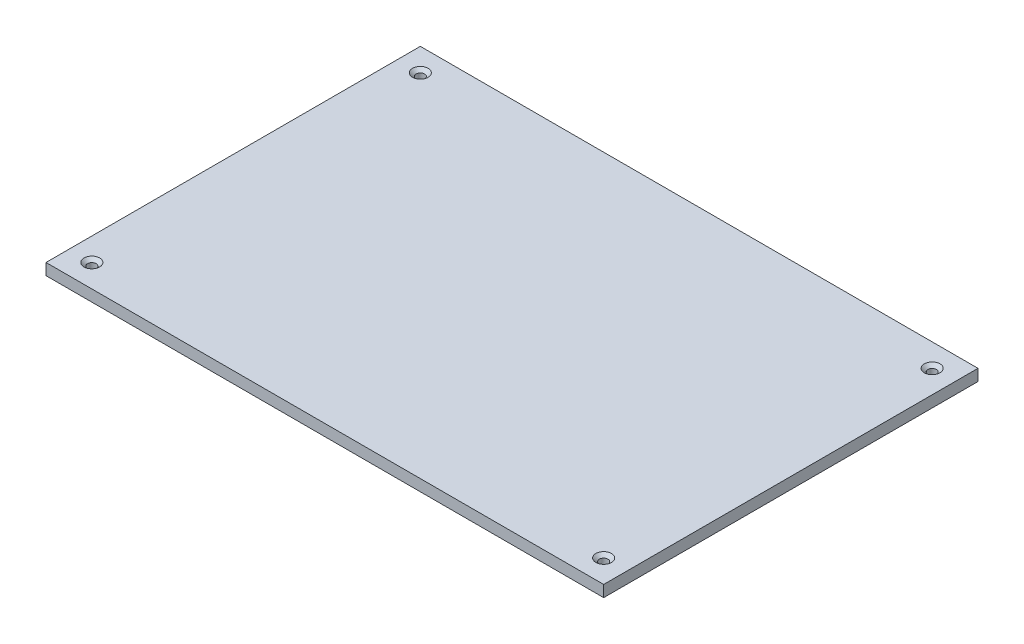
ISO-10303-21;
HEADER;
FILE_DESCRIPTION(('STEP AP214'),'2;1');
FILE_NAME('part.step','',(''),(''),'','','');
FILE_SCHEMA(('AUTOMOTIVE_DESIGN { 1 0 10303 214 1 1 1 1 }'));
ENDSEC;
DATA;
#1=APPLICATION_CONTEXT('core data for automotive mechanical design processes');
#2=APPLICATION_PROTOCOL_DEFINITION('international standard','automotive_design',2000,#1);
#3=PRODUCT_CONTEXT('',#1,'mechanical');
#4=PRODUCT('Part','Part','',(#3));
#5=PRODUCT_RELATED_PRODUCT_CATEGORY('part','',(#4));
#6=PRODUCT_DEFINITION_FORMATION('','',#4);
#7=PRODUCT_DEFINITION_CONTEXT('part definition',#1,'design');
#8=PRODUCT_DEFINITION('design','',#6,#7);
#9=PRODUCT_DEFINITION_SHAPE('','',#8);
#10=(LENGTH_UNIT() NAMED_UNIT(*) SI_UNIT(.MILLI.,.METRE.));
#11=(NAMED_UNIT(*) PLANE_ANGLE_UNIT() SI_UNIT($,.RADIAN.));
#12=(NAMED_UNIT(*) SI_UNIT($,.STERADIAN.) SOLID_ANGLE_UNIT());
#13=UNCERTAINTY_MEASURE_WITH_UNIT(LENGTH_MEASURE(1.E-05),#10,'distance_accuracy_value','');
#14=(GEOMETRIC_REPRESENTATION_CONTEXT(3) GLOBAL_UNCERTAINTY_ASSIGNED_CONTEXT((#13)) GLOBAL_UNIT_ASSIGNED_CONTEXT((#10,
#11,#12)) REPRESENTATION_CONTEXT('',''));
#15=CARTESIAN_POINT('',(0.,0.,0.));
#16=DIRECTION('',(0.,0.,1.));
#17=DIRECTION('',(1.,0.,0.));
#18=AXIS2_PLACEMENT_3D('',#15,#16,#17);
#19=CARTESIAN_POINT('',(0.,9.525,0.));
#20=DIRECTION('',(1.,0.,0.));
#21=DIRECTION('',(0.,0.,-1.));
#22=AXIS2_PLACEMENT_3D('',#19,#20,#21);
#23=PLANE('',#22);
#24=DIRECTION('',(0.,0.,1.));
#25=VECTOR('',#24,1.);
#26=CARTESIAN_POINT('',(0.,0.,0.));
#27=LINE('',#26,#25);
#28=CARTESIAN_POINT('',(0.,0.,0.));
#29=VERTEX_POINT('',#28);
#30=CARTESIAN_POINT('',(0.,0.,311.15));
#31=VERTEX_POINT('',#30);
#32=EDGE_CURVE('E119',#29,#31,#27,.T.);
#33=ORIENTED_EDGE('',*,*,#32,.T.);
#34=DIRECTION('',(0.,-1.,0.));
#35=VECTOR('',#34,1.);
#36=CARTESIAN_POINT('',(0.,9.525,311.15));
#37=LINE('',#36,#35);
#38=CARTESIAN_POINT('',(0.,9.525,311.15));
#39=VERTEX_POINT('',#38);
#40=EDGE_CURVE('E110',#39,#31,#37,.T.);
#41=ORIENTED_EDGE('',*,*,#40,.F.);
#42=DIRECTION('',(0.,0.,1.));
#43=VECTOR('',#42,1.);
#44=CARTESIAN_POINT('',(0.,9.525,0.));
#45=LINE('',#44,#43);
#46=CARTESIAN_POINT('',(0.,9.525,0.));
#47=VERTEX_POINT('',#46);
#48=EDGE_CURVE('E104',#47,#39,#45,.T.);
#49=ORIENTED_EDGE('',*,*,#48,.F.);
#50=DIRECTION('',(0.,-1.,0.));
#51=VECTOR('',#50,1.);
#52=CARTESIAN_POINT('',(0.,9.525,0.));
#53=LINE('',#52,#51);
#54=EDGE_CURVE('E115',#47,#29,#53,.T.);
#55=ORIENTED_EDGE('',*,*,#54,.T.);
#56=EDGE_LOOP('',(#33,#41,#49,#55));
#57=FACE_BOUND('',#56,.T.);
#58=ADVANCED_FACE('F51',(#57),#23,.F.);
#59=CARTESIAN_POINT('',(0.,9.525,311.15));
#60=DIRECTION('',(0.,0.,-1.));
#61=DIRECTION('',(-1.,0.,0.));
#62=AXIS2_PLACEMENT_3D('',#59,#60,#61);
#63=PLANE('',#62);
#64=DIRECTION('',(1.,0.,0.));
#65=VECTOR('',#64,1.);
#66=CARTESIAN_POINT('',(0.,0.,311.15));
#67=LINE('',#66,#65);
#68=CARTESIAN_POINT('',(463.55,0.,311.15));
#69=VERTEX_POINT('',#68);
#70=EDGE_CURVE('E109',#31,#69,#67,.T.);
#71=ORIENTED_EDGE('',*,*,#70,.T.);
#72=DIRECTION('',(0.,-1.,0.));
#73=VECTOR('',#72,1.);
#74=CARTESIAN_POINT('',(463.55,9.525,311.15));
#75=LINE('',#74,#73);
#76=CARTESIAN_POINT('',(463.55,9.525,311.15));
#77=VERTEX_POINT('',#76);
#78=EDGE_CURVE('E107',#77,#69,#75,.T.);
#79=ORIENTED_EDGE('',*,*,#78,.F.);
#80=DIRECTION('',(1.,0.,0.));
#81=VECTOR('',#80,1.);
#82=CARTESIAN_POINT('',(0.,9.525,311.15));
#83=LINE('',#82,#81);
#84=EDGE_CURVE('E99',#39,#77,#83,.T.);
#85=ORIENTED_EDGE('',*,*,#84,.F.);
#86=ORIENTED_EDGE('',*,*,#40,.T.);
#87=EDGE_LOOP('',(#71,#79,#85,#86));
#88=FACE_BOUND('',#87,.T.);
#89=ADVANCED_FACE('F108',(#88),#63,.F.);
#90=CARTESIAN_POINT('',(463.55,9.525,0.));
#91=DIRECTION('',(-1.,0.,0.));
#92=DIRECTION('',(0.,0.,1.));
#93=AXIS2_PLACEMENT_3D('',#90,#91,#92);
#94=PLANE('',#93);
#95=DIRECTION('',(0.,0.,-1.));
#96=VECTOR('',#95,1.);
#97=CARTESIAN_POINT('',(463.55,0.,0.));
#98=LINE('',#97,#96);
#99=CARTESIAN_POINT('',(463.55,0.,0.));
#100=VERTEX_POINT('',#99);
#101=EDGE_CURVE('E85',#69,#100,#98,.T.);
#102=ORIENTED_EDGE('',*,*,#101,.T.);
#103=DIRECTION('',(0.,-1.,0.));
#104=VECTOR('',#103,1.);
#105=CARTESIAN_POINT('',(463.55,9.525,0.));
#106=LINE('',#105,#104);
#107=CARTESIAN_POINT('',(463.55,9.525,0.));
#108=VERTEX_POINT('',#107);
#109=EDGE_CURVE('E111',#108,#100,#106,.T.);
#110=ORIENTED_EDGE('',*,*,#109,.F.);
#111=DIRECTION('',(0.,0.,-1.));
#112=VECTOR('',#111,1.);
#113=CARTESIAN_POINT('',(463.55,9.525,0.));
#114=LINE('',#113,#112);
#115=EDGE_CURVE('E102',#77,#108,#114,.T.);
#116=ORIENTED_EDGE('',*,*,#115,.F.);
#117=ORIENTED_EDGE('',*,*,#78,.T.);
#118=EDGE_LOOP('',(#102,#110,#116,#117));
#119=FACE_BOUND('',#118,.T.);
#120=ADVANCED_FACE('F113',(#119),#94,.F.);
#121=CARTESIAN_POINT('',(0.,9.525,0.));
#122=DIRECTION('',(0.,0.,1.));
#123=DIRECTION('',(1.,0.,0.));
#124=AXIS2_PLACEMENT_3D('',#121,#122,#123);
#125=PLANE('',#124);
#126=DIRECTION('',(-1.,0.,0.));
#127=VECTOR('',#126,1.);
#128=CARTESIAN_POINT('',(0.,0.,0.));
#129=LINE('',#128,#127);
#130=EDGE_CURVE('E91',#100,#29,#129,.T.);
#131=ORIENTED_EDGE('',*,*,#130,.T.);
#132=ORIENTED_EDGE('',*,*,#54,.F.);
#133=DIRECTION('',(-1.,0.,0.));
#134=VECTOR('',#133,1.);
#135=CARTESIAN_POINT('',(0.,9.525,0.));
#136=LINE('',#135,#134);
#137=EDGE_CURVE('E68',#108,#47,#136,.T.);
#138=ORIENTED_EDGE('',*,*,#137,.F.);
#139=ORIENTED_EDGE('',*,*,#109,.T.);
#140=EDGE_LOOP('',(#131,#132,#138,#139));
#141=FACE_BOUND('',#140,.T.);
#142=ADVANCED_FACE('F212',(#141),#125,.F.);
#143=CARTESIAN_POINT('',(0.,9.525,0.));
#144=DIRECTION('',(0.,1.,0.));
#145=DIRECTION('',(0.,0.,1.));
#146=AXIS2_PLACEMENT_3D('',#143,#144,#145);
#147=PLANE('',#146);
#148=CARTESIAN_POINT('',(444.5,9.525,292.1));
#149=DIRECTION('',(0.,1.,0.));
#150=DIRECTION('',(0.,0.,1.));
#151=AXIS2_PLACEMENT_3D('',#148,#149,#150);
#152=CIRCLE('',#151,6.49287500000018);
#153=CARTESIAN_POINT('',(444.5,9.525,298.592875));
#154=VERTEX_POINT('',#153);
#155=EDGE_CURVE('E141',#154,#154,#152,.F.);
#156=ORIENTED_EDGE('',*,*,#155,.T.);
#157=EDGE_LOOP('',(#156));
#158=FACE_BOUND('',#157,.T.);
#159=CARTESIAN_POINT('',(444.5,9.525,19.0499999999999));
#160=DIRECTION('',(0.,1.,0.));
#161=DIRECTION('',(0.,0.,1.));
#162=AXIS2_PLACEMENT_3D('',#159,#160,#161);
#163=CIRCLE('',#162,6.49287499999984);
#164=CARTESIAN_POINT('',(444.5,9.525,25.5428749999997));
#165=VERTEX_POINT('',#164);
#166=EDGE_CURVE('E138',#165,#165,#163,.F.);
#167=ORIENTED_EDGE('',*,*,#166,.T.);
#168=EDGE_LOOP('',(#167));
#169=FACE_BOUND('',#168,.T.);
#170=CARTESIAN_POINT('',(19.05,9.525,19.05));
#171=DIRECTION('',(0.,1.,0.));
#172=DIRECTION('',(0.,0.,1.));
#173=AXIS2_PLACEMENT_3D('',#170,#171,#172);
#174=CIRCLE('',#173,6.49287500000001);
#175=CARTESIAN_POINT('',(19.05,9.525,25.542875));
#176=VERTEX_POINT('',#175);
#177=EDGE_CURVE('E135',#176,#176,#174,.F.);
#178=ORIENTED_EDGE('',*,*,#177,.T.);
#179=EDGE_LOOP('',(#178));
#180=FACE_BOUND('',#179,.T.);
#181=CARTESIAN_POINT('',(19.0500000000001,9.525,292.1));
#182=DIRECTION('',(0.,1.,0.));
#183=DIRECTION('',(0.,0.,1.));
#184=AXIS2_PLACEMENT_3D('',#181,#182,#183);
#185=CIRCLE('',#184,6.49287500000001);
#186=CARTESIAN_POINT('',(19.0500000000001,9.525,298.592875));
#187=VERTEX_POINT('',#186);
#188=EDGE_CURVE('E132',#187,#187,#185,.F.);
#189=ORIENTED_EDGE('',*,*,#188,.T.);
#190=EDGE_LOOP('',(#189));
#191=FACE_BOUND('',#190,.T.);
#192=ORIENTED_EDGE('',*,*,#48,.T.);
#193=ORIENTED_EDGE('',*,*,#84,.T.);
#194=ORIENTED_EDGE('',*,*,#115,.T.);
#195=ORIENTED_EDGE('',*,*,#137,.T.);
#196=EDGE_LOOP('',(#192,#193,#194,#195));
#197=FACE_BOUND('',#196,.T.);
#198=ADVANCED_FACE('F100',(#158,#169,#180,#191,#197),#147,.T.);
#199=CARTESIAN_POINT('',(0.,0.,0.));
#200=DIRECTION('',(0.,1.,0.));
#201=DIRECTION('',(0.,0.,1.));
#202=AXIS2_PLACEMENT_3D('',#199,#200,#201);
#203=PLANE('',#202);
#204=CARTESIAN_POINT('',(19.05,0.,19.05));
#205=DIRECTION('',(0.,1.,0.));
#206=DIRECTION('',(0.,0.,1.));
#207=AXIS2_PLACEMENT_3D('',#204,#205,#206);
#208=CIRCLE('',#207,3.571875);
#209=CARTESIAN_POINT('',(19.05,0.,22.621875));
#210=VERTEX_POINT('',#209);
#211=EDGE_CURVE('E193',#210,#210,#208,.F.);
#212=ORIENTED_EDGE('',*,*,#211,.F.);
#213=EDGE_LOOP('',(#212));
#214=FACE_BOUND('',#213,.T.);
#215=CARTESIAN_POINT('',(444.5,0.,292.1));
#216=DIRECTION('',(0.,1.,0.));
#217=DIRECTION('',(0.,0.,1.));
#218=AXIS2_PLACEMENT_3D('',#215,#216,#217);
#219=CIRCLE('',#218,3.57187499999998);
#220=CARTESIAN_POINT('',(444.5,0.,295.671875));
#221=VERTEX_POINT('',#220);
#222=EDGE_CURVE('E191',#221,#221,#219,.F.);
#223=ORIENTED_EDGE('',*,*,#222,.F.);
#224=EDGE_LOOP('',(#223));
#225=FACE_BOUND('',#224,.T.);
#226=CARTESIAN_POINT('',(19.0500000000001,0.,292.1));
#227=DIRECTION('',(0.,1.,0.));
#228=DIRECTION('',(0.,0.,1.));
#229=AXIS2_PLACEMENT_3D('',#226,#227,#228);
#230=CIRCLE('',#229,3.57187499999999);
#231=CARTESIAN_POINT('',(19.0500000000001,0.,295.671875));
#232=VERTEX_POINT('',#231);
#233=EDGE_CURVE('E194',#232,#232,#230,.F.);
#234=ORIENTED_EDGE('',*,*,#233,.F.);
#235=EDGE_LOOP('',(#234));
#236=FACE_BOUND('',#235,.T.);
#237=CARTESIAN_POINT('',(444.5,0.,19.0499999999999));
#238=DIRECTION('',(0.,1.,0.));
#239=DIRECTION('',(0.,0.,1.));
#240=AXIS2_PLACEMENT_3D('',#237,#238,#239);
#241=CIRCLE('',#240,3.57187499999998);
#242=CARTESIAN_POINT('',(444.5,0.,22.6218749999999));
#243=VERTEX_POINT('',#242);
#244=EDGE_CURVE('E122',#243,#243,#241,.F.);
#245=ORIENTED_EDGE('',*,*,#244,.F.);
#246=EDGE_LOOP('',(#245));
#247=FACE_BOUND('',#246,.T.);
#248=ORIENTED_EDGE('',*,*,#32,.F.);
#249=ORIENTED_EDGE('',*,*,#130,.F.);
#250=ORIENTED_EDGE('',*,*,#101,.F.);
#251=ORIENTED_EDGE('',*,*,#70,.F.);
#252=EDGE_LOOP('',(#248,#249,#250,#251));
#253=FACE_BOUND('',#252,.T.);
#254=ADVANCED_FACE('F206',(#214,#225,#236,#247,#253),#203,.F.);
#255=CARTESIAN_POINT('',(444.5,-10.1027881362028,19.0499999999999));
#256=DIRECTION('',(0.,1.,0.));
#257=DIRECTION('',(0.,0.,1.));
#258=AXIS2_PLACEMENT_3D('',#255,#256,#257);
#259=CYLINDRICAL_SURFACE('',#258,3.57187499999998);
#260=CARTESIAN_POINT('',(444.5,6.89491978660613,19.0499999999999));
#261=DIRECTION('',(0.,1.,0.));
#262=DIRECTION('',(0.,0.,1.));
#263=AXIS2_PLACEMENT_3D('',#260,#261,#262);
#264=CIRCLE('',#263,3.57187499999998);
#265=CARTESIAN_POINT('',(444.5,6.89491978660613,22.6218749999999));
#266=VERTEX_POINT('',#265);
#267=EDGE_CURVE('E144',#266,#266,#264,.T.);
#268=ORIENTED_EDGE('',*,*,#267,.T.);
#269=EDGE_LOOP('',(#268));
#270=FACE_BOUND('',#269,.T.);
#271=ORIENTED_EDGE('',*,*,#244,.T.);
#272=EDGE_LOOP('',(#271));
#273=FACE_BOUND('',#272,.T.);
#274=ADVANCED_FACE('F204',(#270,#273),#259,.F.);
#275=CARTESIAN_POINT('',(19.0500000000001,-10.1027881362028,292.1));
#276=DIRECTION('',(0.,1.,0.));
#277=DIRECTION('',(0.,0.,1.));
#278=AXIS2_PLACEMENT_3D('',#275,#276,#277);
#279=CYLINDRICAL_SURFACE('',#278,3.57187499999999);
#280=CARTESIAN_POINT('',(19.0500000000001,6.89491978660603,292.1));
#281=DIRECTION('',(0.,1.,0.));
#282=DIRECTION('',(0.,0.,1.));
#283=AXIS2_PLACEMENT_3D('',#280,#281,#282);
#284=CIRCLE('',#283,3.57187499999999);
#285=CARTESIAN_POINT('',(19.0500000000001,6.89491978660603,295.671875));
#286=VERTEX_POINT('',#285);
#287=EDGE_CURVE('E13',#286,#286,#284,.T.);
#288=ORIENTED_EDGE('',*,*,#287,.T.);
#289=EDGE_LOOP('',(#288));
#290=FACE_BOUND('',#289,.T.);
#291=ORIENTED_EDGE('',*,*,#233,.T.);
#292=EDGE_LOOP('',(#291));
#293=FACE_BOUND('',#292,.T.);
#294=ADVANCED_FACE('F187',(#290,#293),#279,.F.);
#295=CARTESIAN_POINT('',(444.5,-10.1027881362028,292.1));
#296=DIRECTION('',(0.,1.,0.));
#297=DIRECTION('',(0.,0.,1.));
#298=AXIS2_PLACEMENT_3D('',#295,#296,#297);
#299=CYLINDRICAL_SURFACE('',#298,3.57187499999998);
#300=CARTESIAN_POINT('',(444.5,6.89491978660585,292.1));
#301=DIRECTION('',(0.,1.,0.));
#302=DIRECTION('',(0.,0.,1.));
#303=AXIS2_PLACEMENT_3D('',#300,#301,#302);
#304=CIRCLE('',#303,3.57187499999998);
#305=CARTESIAN_POINT('',(444.5,6.89491978660585,295.671875));
#306=VERTEX_POINT('',#305);
#307=EDGE_CURVE('E129',#306,#306,#304,.T.);
#308=ORIENTED_EDGE('',*,*,#307,.T.);
#309=EDGE_LOOP('',(#308));
#310=FACE_BOUND('',#309,.T.);
#311=ORIENTED_EDGE('',*,*,#222,.T.);
#312=EDGE_LOOP('',(#311));
#313=FACE_BOUND('',#312,.T.);
#314=ADVANCED_FACE('F179',(#310,#313),#299,.F.);
#315=CARTESIAN_POINT('',(19.05,-10.1027881362028,19.05));
#316=DIRECTION('',(0.,1.,0.));
#317=DIRECTION('',(0.,0.,1.));
#318=AXIS2_PLACEMENT_3D('',#315,#316,#317);
#319=CYLINDRICAL_SURFACE('',#318,3.571875);
#320=CARTESIAN_POINT('',(19.05,6.89491978660604,19.05));
#321=DIRECTION('',(0.,1.,0.));
#322=DIRECTION('',(0.,0.,1.));
#323=AXIS2_PLACEMENT_3D('',#320,#321,#322);
#324=CIRCLE('',#323,3.571875);
#325=CARTESIAN_POINT('',(19.05,6.89491978660603,22.621875));
#326=VERTEX_POINT('',#325);
#327=EDGE_CURVE('E60',#326,#326,#324,.T.);
#328=ORIENTED_EDGE('',*,*,#327,.T.);
#329=EDGE_LOOP('',(#328));
#330=FACE_BOUND('',#329,.T.);
#331=ORIENTED_EDGE('',*,*,#211,.T.);
#332=EDGE_LOOP('',(#331));
#333=FACE_BOUND('',#332,.T.);
#334=ADVANCED_FACE('F149',(#330,#333),#319,.F.);
#335=CARTESIAN_POINT('',(444.5,6.89491978660585,292.1));
#336=DIRECTION('',(0.,1.,0.));
#337=DIRECTION('',(0.,0.,1.));
#338=AXIS2_PLACEMENT_3D('',#335,#336,#337);
#339=CONICAL_SURFACE('',#338,3.57187499999998,0.837758040957282);
#340=ORIENTED_EDGE('',*,*,#155,.F.);
#341=EDGE_LOOP('',(#340));
#342=FACE_BOUND('',#341,.T.);
#343=ORIENTED_EDGE('',*,*,#307,.F.);
#344=EDGE_LOOP('',(#343));
#345=FACE_BOUND('',#344,.T.);
#346=ADVANCED_FACE('F161',(#342,#345),#339,.F.);
#347=CARTESIAN_POINT('',(444.5,6.89491978660613,19.0499999999999));
#348=DIRECTION('',(0.,1.,0.));
#349=DIRECTION('',(0.,0.,1.));
#350=AXIS2_PLACEMENT_3D('',#347,#348,#349);
#351=CONICAL_SURFACE('',#350,3.57187499999998,0.837758040957278);
#352=ORIENTED_EDGE('',*,*,#166,.F.);
#353=EDGE_LOOP('',(#352));
#354=FACE_BOUND('',#353,.T.);
#355=ORIENTED_EDGE('',*,*,#267,.F.);
#356=EDGE_LOOP('',(#355));
#357=FACE_BOUND('',#356,.T.);
#358=ADVANCED_FACE('F154',(#354,#357),#351,.F.);
#359=CARTESIAN_POINT('',(19.05,6.89491978660604,19.05));
#360=DIRECTION('',(0.,1.,0.));
#361=DIRECTION('',(0.,0.,1.));
#362=AXIS2_PLACEMENT_3D('',#359,#360,#361);
#363=CONICAL_SURFACE('',#362,3.571875,0.837758040957285);
#364=CARTESIAN_POINT('',(19.05,9.525,25.542875));
#365=CARTESIAN_POINT('',(19.05,9.49760333111048,25.5124479166667));
#366=CARTESIAN_POINT('',(19.05,9.47020666222096,25.4820208333333));
#367=CARTESIAN_POINT('',(19.05,9.41541332444192,25.4211666666667));
#368=CARTESIAN_POINT('',(19.05,9.3880166555524,25.3907395833333));
#369=CARTESIAN_POINT('',(19.05,9.33322331777336,25.3298854166667));
#370=CARTESIAN_POINT('',(19.05,9.30582664888384,25.2994583333333));
#371=CARTESIAN_POINT('',(19.05,9.2510333111048,25.2386041666667));
#372=CARTESIAN_POINT('',(19.05,9.22363664221528,25.2081770833333));
#373=CARTESIAN_POINT('',(19.05,9.16884330443624,25.1473229166667));
#374=CARTESIAN_POINT('',(19.05,9.14144663554671,25.1168958333333));
#375=CARTESIAN_POINT('',(19.05,9.08665329776767,25.0560416666667));
#376=CARTESIAN_POINT('',(19.05,9.05925662887815,25.0256145833333));
#377=CARTESIAN_POINT('',(19.05,9.00446329109911,24.9647604166667));
#378=CARTESIAN_POINT('',(19.05,8.97706662220959,24.9343333333333));
#379=CARTESIAN_POINT('',(19.05,8.92227328443055,24.8734791666667));
#380=CARTESIAN_POINT('',(19.05,8.89487661554103,24.8430520833333));
#381=CARTESIAN_POINT('',(19.05,8.84008327776199,24.7821979166667));
#382=CARTESIAN_POINT('',(19.05,8.81268660887247,24.7517708333333));
#383=CARTESIAN_POINT('',(19.05,8.75789327109343,24.6909166666667));
#384=CARTESIAN_POINT('',(19.05,8.73049660220391,24.6604895833333));
#385=CARTESIAN_POINT('',(19.05,8.67570326442487,24.5996354166667));
#386=CARTESIAN_POINT('',(19.05,8.64830659553535,24.5692083333333));
#387=CARTESIAN_POINT('',(19.05,8.5935132577563,24.5083541666667));
#388=CARTESIAN_POINT('',(19.05,8.56611658886678,24.4779270833333));
#389=CARTESIAN_POINT('',(19.05,8.51132325108774,24.4170729166667));
#390=CARTESIAN_POINT('',(19.05,8.48392658219822,24.3866458333333));
#391=CARTESIAN_POINT('',(19.05,8.42913324441918,24.3257916666667));
#392=CARTESIAN_POINT('',(19.05,8.40173657552966,24.2953645833333));
#393=CARTESIAN_POINT('',(19.05,8.34694323775062,24.2345104166667));
#394=CARTESIAN_POINT('',(19.05,8.3195465688611,24.2040833333333));
#395=CARTESIAN_POINT('',(19.05,8.26475323108206,24.1432291666667));
#396=CARTESIAN_POINT('',(19.05,8.23735656219254,24.1128020833333));
#397=CARTESIAN_POINT('',(19.05,8.1825632244135,24.0519479166667));
#398=CARTESIAN_POINT('',(19.05,8.15516655552398,24.0215208333333));
#399=CARTESIAN_POINT('',(19.05,8.10037321774493,23.9606666666667));
#400=CARTESIAN_POINT('',(19.05,8.07297654885542,23.9302395833333));
#401=CARTESIAN_POINT('',(19.05,8.01818321107637,23.8693854166667));
#402=CARTESIAN_POINT('',(19.05,7.99078654218685,23.8389583333333));
#403=CARTESIAN_POINT('',(19.05,7.93599320440781,23.7781041666667));
#404=CARTESIAN_POINT('',(19.05,7.90859653551829,23.7476770833333));
#405=CARTESIAN_POINT('',(19.05,7.85380319773925,23.6868229166667));
#406=CARTESIAN_POINT('',(19.05,7.82640652884973,23.6563958333333));
#407=CARTESIAN_POINT('',(19.05,7.77161319107069,23.5955416666667));
#408=CARTESIAN_POINT('',(19.05,7.74421652218117,23.5651145833333));
#409=CARTESIAN_POINT('',(19.05,7.68942318440213,23.5042604166667));
#410=CARTESIAN_POINT('',(19.05,7.66202651551261,23.4738333333333));
#411=CARTESIAN_POINT('',(19.05,7.60723317773357,23.4129791666667));
#412=CARTESIAN_POINT('',(19.05,7.57983650884405,23.3825520833333));
#413=CARTESIAN_POINT('',(19.05,7.525043171065,23.3216979166667));
#414=CARTESIAN_POINT('',(19.05,7.49764650217549,23.2912708333333));
#415=CARTESIAN_POINT('',(19.05,7.44285316439644,23.2304166666666));
#416=CARTESIAN_POINT('',(19.05,7.41545649550692,23.1999895833333));
#417=CARTESIAN_POINT('',(19.05,7.36066315772788,23.1391354166667));
#418=CARTESIAN_POINT('',(19.05,7.33326648883836,23.1087083333333));
#419=CARTESIAN_POINT('',(19.05,7.27847315105932,23.0478541666666));
#420=CARTESIAN_POINT('',(19.05,7.2510764821698,23.0174270833333));
#421=CARTESIAN_POINT('',(19.05,7.19628314439076,22.9565729166667));
#422=CARTESIAN_POINT('',(19.05,7.16888647550124,22.9261458333333));
#423=CARTESIAN_POINT('',(19.05,7.1140931377222,22.8652916666666));
#424=CARTESIAN_POINT('',(19.05,7.08669646883268,22.8348645833333));
#425=CARTESIAN_POINT('',(19.05,7.03190313105364,22.7740104166666));
#426=CARTESIAN_POINT('',(19.05,7.00450646216412,22.7435833333333));
#427=CARTESIAN_POINT('',(19.05,6.94971312438508,22.6827291666666));
#428=CARTESIAN_POINT('',(19.05,6.92231645549556,22.6523020833333));
#429=CARTESIAN_POINT('',(19.05,6.89491978660604,22.621875));
#430=B_SPLINE_CURVE_WITH_KNOTS('',3,(#364,#365,#366,#367,#368,#369,#370,#371,#372,#373,#374,
#375,#376,#377,#378,#379,#380,#381,#382,#383,#384,#385,#386,#387,#388,#389,#390,#391,#392,#393,
#394,#395,#396,#397,#398,#399,#400,#401,#402,#403,#404,#405,#406,#407,#408,#409,#410,#411,#412,
#413,#414,#415,#416,#417,#418,#419,#420,#421,#422,#423,#424,#425,#426,#427,#428,#429),
.UNSPECIFIED.,.F.,.F.,(4,2,2,2,2,2,2,2,2,2,2,2,2,2,2,2,2,2,2,2,2,2,2,2,2,2,2,2,2,2,2,2,4),(0.,
0.122831037599381,0.245662075198764,0.368493112798146,0.491324150397526,0.614155187996908,
0.73698622559629,0.859817263195674,0.982648300795054,1.10547933839444,1.22831037599382,
1.3511414135932,1.47397245119258,1.59680348879196,1.71963452639135,1.84246556399073,
1.96529660159011,2.08812763918949,2.21095867678887,2.33378971438825,2.45662075198764,
2.57945178958702,2.7022828271864,2.82511386478578,2.94794490238516,3.07077593998455,
3.19360697758393,3.31643801518331,3.43926905278269,3.56210009038207,3.68493112798145,
3.80776216558084,3.93059320318022),.UNSPECIFIED.);
#431=EDGE_CURVE('BSEAM152',#176,#326,#430,.T.);
#432=ORIENTED_EDGE('',*,*,#177,.F.);
#433=ORIENTED_EDGE('',*,*,#327,.F.);
#434=ORIENTED_EDGE('',*,*,#431,.T.);
#435=ORIENTED_EDGE('',*,*,#431,.F.);
#436=EDGE_LOOP('',(#432,#434,#433,#435));
#437=FACE_BOUND('',#436,.T.);
#438=ADVANCED_FACE('F152',(#437),#363,.F.);
#439=CARTESIAN_POINT('',(19.0500000000001,6.89491978660603,292.1));
#440=DIRECTION('',(0.,1.,0.));
#441=DIRECTION('',(0.,0.,1.));
#442=AXIS2_PLACEMENT_3D('',#439,#440,#441);
#443=CONICAL_SURFACE('',#442,3.57187499999999,0.837758040957285);
#444=ORIENTED_EDGE('',*,*,#188,.F.);
#445=EDGE_LOOP('',(#444));
#446=FACE_BOUND('',#445,.T.);
#447=ORIENTED_EDGE('',*,*,#287,.F.);
#448=EDGE_LOOP('',(#447));
#449=FACE_BOUND('',#448,.T.);
#450=ADVANCED_FACE('F53',(#446,#449),#443,.F.);
#451=CLOSED_SHELL('',(#58,#89,#120,#142,#198,#254,#274,#294,#314,#334,#346,#358,#438,#450));
#452=MANIFOLD_SOLID_BREP('B2',#451);
#453=ADVANCED_BREP_SHAPE_REPRESENTATION('',(#18,#452),#14);
#454=SHAPE_DEFINITION_REPRESENTATION(#9,#453);
ENDSEC;
END-ISO-10303-21;
